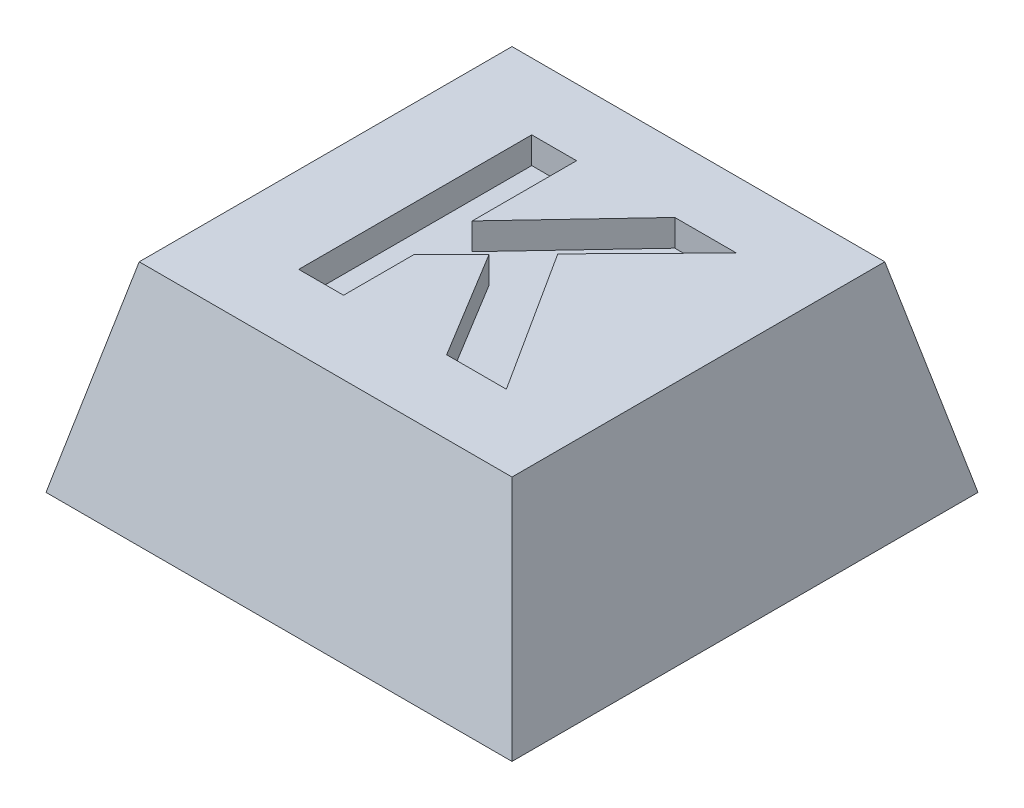
ISO-10303-21;
HEADER;
FILE_DESCRIPTION(('STEP AP214'),'2;1');
FILE_NAME('part.step','',(''),(''),'','','');
FILE_SCHEMA(('AUTOMOTIVE_DESIGN { 1 0 10303 214 1 1 1 1 }'));
ENDSEC;
DATA;
#1=APPLICATION_CONTEXT('core data for automotive mechanical design processes');
#2=APPLICATION_PROTOCOL_DEFINITION('international standard','automotive_design',2000,#1);
#3=PRODUCT_CONTEXT('',#1,'mechanical');
#4=PRODUCT('Part','Part','',(#3));
#5=PRODUCT_RELATED_PRODUCT_CATEGORY('part','',(#4));
#6=PRODUCT_DEFINITION_FORMATION('','',#4);
#7=PRODUCT_DEFINITION_CONTEXT('part definition',#1,'design');
#8=PRODUCT_DEFINITION('design','',#6,#7);
#9=PRODUCT_DEFINITION_SHAPE('','',#8);
#10=(LENGTH_UNIT() NAMED_UNIT(*) SI_UNIT(.MILLI.,.METRE.));
#11=(NAMED_UNIT(*) PLANE_ANGLE_UNIT() SI_UNIT($,.RADIAN.));
#12=(NAMED_UNIT(*) SI_UNIT($,.STERADIAN.) SOLID_ANGLE_UNIT());
#13=UNCERTAINTY_MEASURE_WITH_UNIT(LENGTH_MEASURE(1.E-05),#10,'distance_accuracy_value','');
#14=(GEOMETRIC_REPRESENTATION_CONTEXT(3) GLOBAL_UNCERTAINTY_ASSIGNED_CONTEXT((#13)) GLOBAL_UNIT_ASSIGNED_CONTEXT((#10,
#11,#12)) REPRESENTATION_CONTEXT('',''));
#15=CARTESIAN_POINT('',(0.,0.,0.));
#16=DIRECTION('',(0.,0.,1.));
#17=DIRECTION('',(1.,0.,0.));
#18=AXIS2_PLACEMENT_3D('',#15,#16,#17);
#19=CARTESIAN_POINT('',(0.,3.,0.));
#20=DIRECTION('',(0.,-1.,0.));
#21=DIRECTION('',(0.,0.,-1.));
#22=AXIS2_PLACEMENT_3D('',#19,#20,#21);
#23=PLANE('',#22);
#24=DIRECTION('',(-1.,0.,0.));
#25=VECTOR('',#24,1.);
#26=CARTESIAN_POINT('',(11.,3.,-0.7));
#27=LINE('',#26,#25);
#28=CARTESIAN_POINT('',(6.3,3.,-0.7));
#29=VERTEX_POINT('',#28);
#30=CARTESIAN_POINT('',(0.7,3.,-0.7));
#31=VERTEX_POINT('',#30);
#32=EDGE_CURVE('E65',#29,#31,#27,.T.);
#33=ORIENTED_EDGE('',*,*,#32,.F.);
#34=DIRECTION('',(0.,0.,1.));
#35=VECTOR('',#34,1.);
#36=CARTESIAN_POINT('',(6.3,3.,-7.));
#37=LINE('',#36,#35);
#38=CARTESIAN_POINT('',(6.3,3.,-6.3));
#39=VERTEX_POINT('',#38);
#40=EDGE_CURVE('E206',#39,#29,#37,.T.);
#41=ORIENTED_EDGE('',*,*,#40,.F.);
#42=DIRECTION('',(-1.,0.,0.));
#43=VECTOR('',#42,1.);
#44=CARTESIAN_POINT('',(11.,3.,-6.3));
#45=LINE('',#44,#43);
#46=CARTESIAN_POINT('',(0.699999999999998,3.,-6.3));
#47=VERTEX_POINT('',#46);
#48=EDGE_CURVE('E193',#39,#47,#45,.T.);
#49=ORIENTED_EDGE('',*,*,#48,.T.);
#50=DIRECTION('',(0.,0.,1.));
#51=VECTOR('',#50,1.);
#52=CARTESIAN_POINT('',(0.7,3.,-7.));
#53=LINE('',#52,#51);
#54=EDGE_CURVE('E207',#47,#31,#53,.T.);
#55=ORIENTED_EDGE('',*,*,#54,.T.);
#56=EDGE_LOOP('',(#33,#41,#49,#55));
#57=FACE_BOUND('',#56,.T.);
#58=DIRECTION('',(-1.,0.,0.));
#59=VECTOR('',#58,1.);
#60=CARTESIAN_POINT('',(2.66988821627738,3.,-1.79976415733689));
#61=LINE('',#60,#59);
#62=CARTESIAN_POINT('',(2.66988821627738,3.,-1.79976415733689));
#63=VERTEX_POINT('',#62);
#64=CARTESIAN_POINT('',(1.99681129320046,3.,-1.79976415733689));
#65=VERTEX_POINT('',#64);
#66=EDGE_CURVE('E58',#63,#65,#61,.T.);
#67=ORIENTED_EDGE('',*,*,#66,.T.);
#68=DIRECTION('',(0.,0.,-1.));
#69=VECTOR('',#68,1.);
#70=CARTESIAN_POINT('',(1.99681129320046,3.,-1.79976415733689));
#71=LINE('',#70,#69);
#72=CARTESIAN_POINT('',(1.99681129320046,3.,-5.29976415733689));
#73=VERTEX_POINT('',#72);
#74=EDGE_CURVE('E177',#65,#73,#71,.T.);
#75=ORIENTED_EDGE('',*,*,#74,.T.);
#76=DIRECTION('',(1.,0.,0.));
#77=VECTOR('',#76,1.);
#78=CARTESIAN_POINT('',(1.99681129320046,3.,-5.29976415733689));
#79=LINE('',#78,#77);
#80=CARTESIAN_POINT('',(2.66988821627738,3.,-5.29976415733689));
#81=VERTEX_POINT('',#80);
#82=EDGE_CURVE('E532',#73,#81,#79,.T.);
#83=ORIENTED_EDGE('',*,*,#82,.T.);
#84=DIRECTION('',(0.,0.,1.));
#85=VECTOR('',#84,1.);
#86=CARTESIAN_POINT('',(2.66988821627738,3.,-5.29976415733689));
#87=LINE('',#86,#85);
#88=CARTESIAN_POINT('',(2.66988821627738,3.,-3.73275694579843));
#89=VERTEX_POINT('',#88);
#90=EDGE_CURVE('E534',#81,#89,#87,.T.);
#91=ORIENTED_EDGE('',*,*,#90,.T.);
#92=DIRECTION('',(0.685618651018228,0.,-0.727960895499164));
#93=VECTOR('',#92,1.);
#94=CARTESIAN_POINT('',(2.66988821627738,3.,-3.73275694579843));
#95=LINE('',#94,#93);
#96=CARTESIAN_POINT('',(4.14574959448251,3.,-5.29976415733689));
#97=VERTEX_POINT('',#96);
#98=EDGE_CURVE('E539',#89,#97,#95,.T.);
#99=ORIENTED_EDGE('',*,*,#98,.T.);
#100=DIRECTION('',(1.,0.,0.));
#101=VECTOR('',#100,1.);
#102=CARTESIAN_POINT('',(4.14574959448251,3.,-5.29976415733689));
#103=LINE('',#102,#101);
#104=CARTESIAN_POINT('',(5.07052924191841,3.,-5.29976415733689));
#105=VERTEX_POINT('',#104);
#106=EDGE_CURVE('E549',#97,#105,#103,.T.);
#107=ORIENTED_EDGE('',*,*,#106,.T.);
#108=DIRECTION('',(-0.700795359660879,0.,0.713362365055642));
#109=VECTOR('',#108,1.);
#110=CARTESIAN_POINT('',(5.07052924191841,3.,-5.29976415733689));
#111=LINE('',#110,#109);
#112=CARTESIAN_POINT('',(3.74120231884149,3.,-3.94659909323432));
#113=VERTEX_POINT('',#112);
#114=EDGE_CURVE('E553',#105,#113,#111,.T.);
#115=ORIENTED_EDGE('',*,*,#114,.T.);
#116=DIRECTION('',(0.53911613745139,0.,0.842231435140896));
#117=VECTOR('',#116,1.);
#118=CARTESIAN_POINT('',(3.74120231884149,3.,-3.94659909323432));
#119=LINE('',#118,#117);
#120=CARTESIAN_POINT('',(5.11540103679021,3.,-1.79976415733689));
#121=VERTEX_POINT('',#120);
#122=EDGE_CURVE('E557',#113,#121,#119,.T.);
#123=ORIENTED_EDGE('',*,*,#122,.T.);
#124=DIRECTION('',(-1.,0.,0.));
#125=VECTOR('',#124,1.);
#126=CARTESIAN_POINT('',(5.11540103679021,3.,-1.79976415733689));
#127=LINE('',#126,#125);
#128=CARTESIAN_POINT('',(4.21866626114918,3.,-1.79976415733689));
#129=VERTEX_POINT('',#128);
#130=EDGE_CURVE('E498',#121,#129,#127,.T.);
#131=ORIENTED_EDGE('',*,*,#130,.T.);
#132=DIRECTION('',(-0.519256993232864,0.,-0.854618145711151));
#133=VECTOR('',#132,1.);
#134=CARTESIAN_POINT('',(4.21866626114918,3.,-1.79976415733689));
#135=LINE('',#134,#133);
#136=CARTESIAN_POINT('',(3.23078565217482,3.,-3.42566559964458));
#137=VERTEX_POINT('',#136);
#138=EDGE_CURVE('E493',#129,#137,#135,.T.);
#139=ORIENTED_EDGE('',*,*,#138,.T.);
#140=DIRECTION('',(-0.700946895976961,0.,0.713213466656557));
#141=VECTOR('',#140,1.);
#142=CARTESIAN_POINT('',(3.23078565217482,3.,-3.42566559964458));
#143=LINE('',#142,#141);
#144=CARTESIAN_POINT('',(2.66988821627738,3.,-2.85495245861894));
#145=VERTEX_POINT('',#144);
#146=EDGE_CURVE('E487',#137,#145,#143,.T.);
#147=ORIENTED_EDGE('',*,*,#146,.T.);
#148=DIRECTION('',(0.,0.,1.));
#149=VECTOR('',#148,1.);
#150=CARTESIAN_POINT('',(2.66988821627738,3.,-2.85495245861894));
#151=LINE('',#150,#149);
#152=EDGE_CURVE('E173',#145,#63,#151,.T.);
#153=ORIENTED_EDGE('',*,*,#152,.T.);
#154=EDGE_LOOP('',(#67,#75,#83,#91,#99,#107,#115,#123,#131,#139,#147,#153));
#155=FACE_BOUND('',#154,.T.);
#156=ADVANCED_FACE('F42',(#57,#155),#23,.F.);
#157=CARTESIAN_POINT('',(7.,0.,-7.));
#158=DIRECTION('',(-0.973841209741793,-0.227229615606418,0.));
#159=DIRECTION('',(0.227229615606418,-0.973841209741793,0.));
#160=AXIS2_PLACEMENT_3D('',#157,#158,#159);
#161=PLANE('',#160);
#162=DIRECTION('',(-0.221581128241521,0.949633406749377,-0.221581128241521));
#163=VECTOR('',#162,1.);
#164=CARTESIAN_POINT('',(6.6563126252505,1.47294589178357,-0.343687374749499));
#165=LINE('',#164,#163);
#166=CARTESIAN_POINT('',(7.,0.,0.));
#167=VERTEX_POINT('',#166);
#168=EDGE_CURVE('E203',#167,#29,#165,.T.);
#169=ORIENTED_EDGE('',*,*,#168,.F.);
#170=DIRECTION('',(0.,0.,-1.));
#171=VECTOR('',#170,1.);
#172=CARTESIAN_POINT('',(7.,0.,0.));
#173=LINE('',#172,#171);
#174=CARTESIAN_POINT('',(7.,0.,-7.));
#175=VERTEX_POINT('',#174);
#176=EDGE_CURVE('E221',#167,#175,#173,.T.);
#177=ORIENTED_EDGE('',*,*,#176,.T.);
#178=DIRECTION('',(0.221581128241521,-0.949633406749377,-0.221581128241521));
#179=VECTOR('',#178,1.);
#180=CARTESIAN_POINT('',(7.,0.,-7.));
#181=LINE('',#180,#179);
#182=EDGE_CURVE('E197',#39,#175,#181,.T.);
#183=ORIENTED_EDGE('',*,*,#182,.F.);
#184=ORIENTED_EDGE('',*,*,#40,.T.);
#185=EDGE_LOOP('',(#169,#177,#183,#184));
#186=FACE_BOUND('',#185,.T.);
#187=ADVANCED_FACE('F246',(#186),#161,.F.);
#188=CARTESIAN_POINT('',(0.,0.,-7.));
#189=DIRECTION('',(0.973841209741793,-0.227229615606418,0.));
#190=DIRECTION('',(0.227229615606418,0.973841209741793,0.));
#191=AXIS2_PLACEMENT_3D('',#188,#189,#190);
#192=PLANE('',#191);
#193=DIRECTION('',(-0.221581128241521,-0.949633406749378,0.221581128241521));
#194=VECTOR('',#193,1.);
#195=CARTESIAN_POINT('',(0.343687374749499,1.47294589178357,-0.3436873747495));
#196=LINE('',#195,#194);
#197=CARTESIAN_POINT('',(0.,0.,0.));
#198=VERTEX_POINT('',#197);
#199=EDGE_CURVE('E11',#31,#198,#196,.T.);
#200=ORIENTED_EDGE('',*,*,#199,.F.);
#201=ORIENTED_EDGE('',*,*,#54,.F.);
#202=DIRECTION('',(0.221581128241521,0.949633406749377,0.221581128241521));
#203=VECTOR('',#202,1.);
#204=CARTESIAN_POINT('',(0.,0.,-7.));
#205=LINE('',#204,#203);
#206=CARTESIAN_POINT('',(0.,0.,-7.));
#207=VERTEX_POINT('',#206);
#208=EDGE_CURVE('E51',#207,#47,#205,.T.);
#209=ORIENTED_EDGE('',*,*,#208,.F.);
#210=DIRECTION('',(0.,0.,1.));
#211=VECTOR('',#210,1.);
#212=CARTESIAN_POINT('',(0.,0.,0.));
#213=LINE('',#212,#211);
#214=EDGE_CURVE('E211',#207,#198,#213,.T.);
#215=ORIENTED_EDGE('',*,*,#214,.T.);
#216=EDGE_LOOP('',(#200,#201,#209,#215));
#217=FACE_BOUND('',#216,.T.);
#218=ADVANCED_FACE('F239',(#217),#192,.F.);
#219=CARTESIAN_POINT('',(0.,0.,0.));
#220=DIRECTION('',(0.,-1.,0.));
#221=DIRECTION('',(0.,0.,-1.));
#222=AXIS2_PLACEMENT_3D('',#219,#220,#221);
#223=PLANE('',#222);
#224=CARTESIAN_POINT('',(3.5,0.,-3.5));
#225=DIRECTION('',(0.,-1.,0.));
#226=DIRECTION('',(0.,0.,-1.));
#227=AXIS2_PLACEMENT_3D('',#224,#225,#226);
#228=CIRCLE('',#227,1.8);
#229=CARTESIAN_POINT('',(3.5,0.,-5.3));
#230=VERTEX_POINT('',#229);
#231=EDGE_CURVE('E179',#230,#230,#228,.T.);
#232=ORIENTED_EDGE('',*,*,#231,.F.);
#233=EDGE_LOOP('',(#232));
#234=FACE_BOUND('',#233,.T.);
#235=ORIENTED_EDGE('',*,*,#214,.F.);
#236=DIRECTION('',(-1.,0.,0.));
#237=VECTOR('',#236,1.);
#238=CARTESIAN_POINT('',(0.,0.,-7.));
#239=LINE('',#238,#237);
#240=EDGE_CURVE('E225',#175,#207,#239,.T.);
#241=ORIENTED_EDGE('',*,*,#240,.F.);
#242=ORIENTED_EDGE('',*,*,#176,.F.);
#243=DIRECTION('',(1.,0.,0.));
#244=VECTOR('',#243,1.);
#245=CARTESIAN_POINT('',(0.,0.,0.));
#246=LINE('',#245,#244);
#247=EDGE_CURVE('E218',#198,#167,#246,.T.);
#248=ORIENTED_EDGE('',*,*,#247,.F.);
#249=EDGE_LOOP('',(#235,#241,#242,#248));
#250=FACE_BOUND('',#249,.T.);
#251=ADVANCED_FACE('F44',(#234,#250),#223,.T.);
#252=CARTESIAN_POINT('',(11.,3.,-6.3));
#253=DIRECTION('',(0.,0.227229615606418,-0.973841209741793));
#254=DIRECTION('',(0.,0.973841209741793,0.227229615606418));
#255=AXIS2_PLACEMENT_3D('',#252,#253,#254);
#256=PLANE('',#255);
#257=ORIENTED_EDGE('',*,*,#182,.T.);
#258=ORIENTED_EDGE('',*,*,#240,.T.);
#259=ORIENTED_EDGE('',*,*,#208,.T.);
#260=ORIENTED_EDGE('',*,*,#48,.F.);
#261=EDGE_LOOP('',(#257,#258,#259,#260));
#262=FACE_BOUND('',#261,.T.);
#263=ADVANCED_FACE('F230',(#262),#256,.T.);
#264=CARTESIAN_POINT('',(11.,0.,0.));
#265=DIRECTION('',(0.,0.227229615606418,0.973841209741793));
#266=DIRECTION('',(0.,-0.973841209741793,0.227229615606418));
#267=AXIS2_PLACEMENT_3D('',#264,#265,#266);
#268=PLANE('',#267);
#269=ORIENTED_EDGE('',*,*,#168,.T.);
#270=ORIENTED_EDGE('',*,*,#32,.T.);
#271=ORIENTED_EDGE('',*,*,#199,.T.);
#272=ORIENTED_EDGE('',*,*,#247,.T.);
#273=EDGE_LOOP('',(#269,#270,#271,#272));
#274=FACE_BOUND('',#273,.T.);
#275=ADVANCED_FACE('F241',(#274),#268,.T.);
#276=CARTESIAN_POINT('',(3.5,0.8,-3.5));
#277=DIRECTION('',(0.,-1.,0.));
#278=DIRECTION('',(0.,0.,-1.));
#279=AXIS2_PLACEMENT_3D('',#276,#277,#278);
#280=CYLINDRICAL_SURFACE('',#279,1.8);
#281=CARTESIAN_POINT('',(3.5,0.8,-3.5));
#282=DIRECTION('',(0.,-1.,0.));
#283=DIRECTION('',(0.,0.,-1.));
#284=AXIS2_PLACEMENT_3D('',#281,#282,#283);
#285=CIRCLE('',#284,1.8);
#286=CARTESIAN_POINT('',(3.5,0.8,-5.3));
#287=VERTEX_POINT('',#286);
#288=EDGE_CURVE('E185',#287,#287,#285,.T.);
#289=ORIENTED_EDGE('',*,*,#288,.F.);
#290=EDGE_LOOP('',(#289));
#291=FACE_BOUND('',#290,.T.);
#292=ORIENTED_EDGE('',*,*,#231,.T.);
#293=EDGE_LOOP('',(#292));
#294=FACE_BOUND('',#293,.T.);
#295=ADVANCED_FACE('F266',(#291,#294),#280,.F.);
#296=CARTESIAN_POINT('',(3.5,0.8,-3.5));
#297=DIRECTION('',(0.,-1.,0.));
#298=DIRECTION('',(0.,0.,-1.));
#299=AXIS2_PLACEMENT_3D('',#296,#297,#298);
#300=PLANE('',#299);
#301=ORIENTED_EDGE('',*,*,#288,.T.);
#302=EDGE_LOOP('',(#301));
#303=FACE_BOUND('',#302,.T.);
#304=ADVANCED_FACE('F269',(#303),#300,.T.);
#305=CARTESIAN_POINT('',(2.66988821627738,2.6,-1.79976415733689));
#306=DIRECTION('',(0.,0.,-1.));
#307=DIRECTION('',(-1.,0.,0.));
#308=AXIS2_PLACEMENT_3D('',#305,#306,#307);
#309=PLANE('',#308);
#310=ORIENTED_EDGE('',*,*,#66,.F.);
#311=DIRECTION('',(0.,1.,0.));
#312=VECTOR('',#311,1.);
#313=CARTESIAN_POINT('',(2.66988821627738,2.6,-1.79976415733689));
#314=LINE('',#313,#312);
#315=CARTESIAN_POINT('',(2.66988821627738,2.6,-1.79976415733689));
#316=VERTEX_POINT('',#315);
#317=EDGE_CURVE('E171',#316,#63,#314,.T.);
#318=ORIENTED_EDGE('',*,*,#317,.F.);
#319=DIRECTION('',(-1.,0.,0.));
#320=VECTOR('',#319,1.);
#321=CARTESIAN_POINT('',(2.66988821627738,2.6,-1.79976415733689));
#322=LINE('',#321,#320);
#323=CARTESIAN_POINT('',(1.99681129320046,2.6,-1.79976415733689));
#324=VERTEX_POINT('',#323);
#325=EDGE_CURVE('E161',#316,#324,#322,.T.);
#326=ORIENTED_EDGE('',*,*,#325,.T.);
#327=DIRECTION('',(0.,1.,0.));
#328=VECTOR('',#327,1.);
#329=CARTESIAN_POINT('',(1.99681129320046,2.6,-1.79976415733689));
#330=LINE('',#329,#328);
#331=EDGE_CURVE('E170',#324,#65,#330,.T.);
#332=ORIENTED_EDGE('',*,*,#331,.T.);
#333=EDGE_LOOP('',(#310,#318,#326,#332));
#334=FACE_BOUND('',#333,.T.);
#335=ADVANCED_FACE('F169',(#334),#309,.T.);
#336=CARTESIAN_POINT('',(1.99681129320046,2.6,-1.79976415733689));
#337=DIRECTION('',(1.,0.,0.));
#338=DIRECTION('',(0.,0.,-1.));
#339=AXIS2_PLACEMENT_3D('',#336,#337,#338);
#340=PLANE('',#339);
#341=ORIENTED_EDGE('',*,*,#74,.F.);
#342=ORIENTED_EDGE('',*,*,#331,.F.);
#343=DIRECTION('',(0.,0.,-1.));
#344=VECTOR('',#343,1.);
#345=CARTESIAN_POINT('',(1.99681129320046,2.6,-1.79976415733689));
#346=LINE('',#345,#344);
#347=CARTESIAN_POINT('',(1.99681129320046,2.6,-5.29976415733689));
#348=VERTEX_POINT('',#347);
#349=EDGE_CURVE('E157',#324,#348,#346,.T.);
#350=ORIENTED_EDGE('',*,*,#349,.T.);
#351=DIRECTION('',(0.,1.,0.));
#352=VECTOR('',#351,1.);
#353=CARTESIAN_POINT('',(1.99681129320046,2.6,-5.29976415733689));
#354=LINE('',#353,#352);
#355=EDGE_CURVE('E180',#348,#73,#354,.T.);
#356=ORIENTED_EDGE('',*,*,#355,.T.);
#357=EDGE_LOOP('',(#341,#342,#350,#356));
#358=FACE_BOUND('',#357,.T.);
#359=ADVANCED_FACE('F175',(#358),#340,.T.);
#360=CARTESIAN_POINT('',(1.99681129320046,2.6,-5.29976415733689));
#361=DIRECTION('',(0.,0.,1.));
#362=DIRECTION('',(1.,0.,0.));
#363=AXIS2_PLACEMENT_3D('',#360,#361,#362);
#364=PLANE('',#363);
#365=ORIENTED_EDGE('',*,*,#82,.F.);
#366=ORIENTED_EDGE('',*,*,#355,.F.);
#367=DIRECTION('',(1.,0.,0.));
#368=VECTOR('',#367,1.);
#369=CARTESIAN_POINT('',(1.99681129320046,2.6,-5.29976415733689));
#370=LINE('',#369,#368);
#371=CARTESIAN_POINT('',(2.66988821627738,2.6,-5.29976415733689));
#372=VERTEX_POINT('',#371);
#373=EDGE_CURVE('E163',#348,#372,#370,.T.);
#374=ORIENTED_EDGE('',*,*,#373,.T.);
#375=DIRECTION('',(0.,1.,0.));
#376=VECTOR('',#375,1.);
#377=CARTESIAN_POINT('',(2.66988821627738,2.6,-5.29976415733689));
#378=LINE('',#377,#376);
#379=EDGE_CURVE('E187',#372,#81,#378,.T.);
#380=ORIENTED_EDGE('',*,*,#379,.T.);
#381=EDGE_LOOP('',(#365,#366,#374,#380));
#382=FACE_BOUND('',#381,.T.);
#383=ADVANCED_FACE('F278',(#382),#364,.T.);
#384=CARTESIAN_POINT('',(2.66988821627738,2.6,-5.29976415733689));
#385=DIRECTION('',(-1.,0.,0.));
#386=DIRECTION('',(0.,0.,1.));
#387=AXIS2_PLACEMENT_3D('',#384,#385,#386);
#388=PLANE('',#387);
#389=ORIENTED_EDGE('',*,*,#90,.F.);
#390=ORIENTED_EDGE('',*,*,#379,.F.);
#391=DIRECTION('',(0.,0.,1.));
#392=VECTOR('',#391,1.);
#393=CARTESIAN_POINT('',(2.66988821627738,2.6,-5.29976415733689));
#394=LINE('',#393,#392);
#395=CARTESIAN_POINT('',(2.66988821627738,2.6,-3.73275694579843));
#396=VERTEX_POINT('',#395);
#397=EDGE_CURVE('E593',#372,#396,#394,.T.);
#398=ORIENTED_EDGE('',*,*,#397,.T.);
#399=DIRECTION('',(0.,1.,0.));
#400=VECTOR('',#399,1.);
#401=CARTESIAN_POINT('',(2.66988821627738,2.6,-3.73275694579843));
#402=LINE('',#401,#400);
#403=EDGE_CURVE('E525',#396,#89,#402,.T.);
#404=ORIENTED_EDGE('',*,*,#403,.T.);
#405=EDGE_LOOP('',(#389,#390,#398,#404));
#406=FACE_BOUND('',#405,.T.);
#407=ADVANCED_FACE('F281',(#406),#388,.T.);
#408=CARTESIAN_POINT('',(2.66988821627738,2.6,-3.73275694579843));
#409=DIRECTION('',(0.727960895499164,0.,0.685618651018228));
#410=DIRECTION('',(0.685618651018228,0.,-0.727960895499164));
#411=AXIS2_PLACEMENT_3D('',#408,#409,#410);
#412=PLANE('',#411);
#413=ORIENTED_EDGE('',*,*,#98,.F.);
#414=ORIENTED_EDGE('',*,*,#403,.F.);
#415=DIRECTION('',(0.685618651018228,0.,-0.727960895499164));
#416=VECTOR('',#415,1.);
#417=CARTESIAN_POINT('',(2.66988821627738,2.6,-3.73275694579843));
#418=LINE('',#417,#416);
#419=CARTESIAN_POINT('',(4.14574959448251,2.6,-5.29976415733689));
#420=VERTEX_POINT('',#419);
#421=EDGE_CURVE('E590',#396,#420,#418,.T.);
#422=ORIENTED_EDGE('',*,*,#421,.T.);
#423=DIRECTION('',(0.,1.,0.));
#424=VECTOR('',#423,1.);
#425=CARTESIAN_POINT('',(4.14574959448251,2.6,-5.29976415733689));
#426=LINE('',#425,#424);
#427=EDGE_CURVE('E522',#420,#97,#426,.T.);
#428=ORIENTED_EDGE('',*,*,#427,.T.);
#429=EDGE_LOOP('',(#413,#414,#422,#428));
#430=FACE_BOUND('',#429,.T.);
#431=ADVANCED_FACE('F285',(#430),#412,.T.);
#432=CARTESIAN_POINT('',(4.14574959448251,2.6,-5.29976415733689));
#433=DIRECTION('',(0.,0.,1.));
#434=DIRECTION('',(1.,0.,0.));
#435=AXIS2_PLACEMENT_3D('',#432,#433,#434);
#436=PLANE('',#435);
#437=ORIENTED_EDGE('',*,*,#106,.F.);
#438=ORIENTED_EDGE('',*,*,#427,.F.);
#439=DIRECTION('',(1.,0.,0.));
#440=VECTOR('',#439,1.);
#441=CARTESIAN_POINT('',(4.14574959448251,2.6,-5.29976415733689));
#442=LINE('',#441,#440);
#443=CARTESIAN_POINT('',(5.07052924191841,2.6,-5.29976415733689));
#444=VERTEX_POINT('',#443);
#445=EDGE_CURVE('E587',#420,#444,#442,.T.);
#446=ORIENTED_EDGE('',*,*,#445,.T.);
#447=DIRECTION('',(0.,1.,0.));
#448=VECTOR('',#447,1.);
#449=CARTESIAN_POINT('',(5.07052924191841,2.6,-5.29976415733689));
#450=LINE('',#449,#448);
#451=EDGE_CURVE('E519',#444,#105,#450,.T.);
#452=ORIENTED_EDGE('',*,*,#451,.T.);
#453=EDGE_LOOP('',(#437,#438,#446,#452));
#454=FACE_BOUND('',#453,.T.);
#455=ADVANCED_FACE('F289',(#454),#436,.T.);
#456=CARTESIAN_POINT('',(5.07052924191841,2.6,-5.29976415733689));
#457=DIRECTION('',(-0.713362365055642,0.,-0.700795359660879));
#458=DIRECTION('',(-0.700795359660879,0.,0.713362365055642));
#459=AXIS2_PLACEMENT_3D('',#456,#457,#458);
#460=PLANE('',#459);
#461=ORIENTED_EDGE('',*,*,#114,.F.);
#462=ORIENTED_EDGE('',*,*,#451,.F.);
#463=DIRECTION('',(-0.700795359660879,0.,0.713362365055642));
#464=VECTOR('',#463,1.);
#465=CARTESIAN_POINT('',(5.07052924191841,2.6,-5.29976415733689));
#466=LINE('',#465,#464);
#467=CARTESIAN_POINT('',(3.74120231884149,2.6,-3.94659909323432));
#468=VERTEX_POINT('',#467);
#469=EDGE_CURVE('E584',#444,#468,#466,.T.);
#470=ORIENTED_EDGE('',*,*,#469,.T.);
#471=DIRECTION('',(0.,1.,0.));
#472=VECTOR('',#471,1.);
#473=CARTESIAN_POINT('',(3.74120231884149,2.6,-3.94659909323432));
#474=LINE('',#473,#472);
#475=EDGE_CURVE('E516',#468,#113,#474,.T.);
#476=ORIENTED_EDGE('',*,*,#475,.T.);
#477=EDGE_LOOP('',(#461,#462,#470,#476));
#478=FACE_BOUND('',#477,.T.);
#479=ADVANCED_FACE('F293',(#478),#460,.T.);
#480=CARTESIAN_POINT('',(3.74120231884149,2.6,-3.94659909323432));
#481=DIRECTION('',(-0.842231435140896,0.,0.53911613745139));
#482=DIRECTION('',(0.53911613745139,0.,0.842231435140896));
#483=AXIS2_PLACEMENT_3D('',#480,#481,#482);
#484=PLANE('',#483);
#485=ORIENTED_EDGE('',*,*,#122,.F.);
#486=ORIENTED_EDGE('',*,*,#475,.F.);
#487=DIRECTION('',(0.53911613745139,0.,0.842231435140896));
#488=VECTOR('',#487,1.);
#489=CARTESIAN_POINT('',(3.74120231884149,2.6,-3.94659909323432));
#490=LINE('',#489,#488);
#491=CARTESIAN_POINT('',(5.11540103679021,2.6,-1.79976415733689));
#492=VERTEX_POINT('',#491);
#493=EDGE_CURVE('E581',#468,#492,#490,.T.);
#494=ORIENTED_EDGE('',*,*,#493,.T.);
#495=DIRECTION('',(0.,1.,0.));
#496=VECTOR('',#495,1.);
#497=CARTESIAN_POINT('',(5.11540103679021,2.6,-1.79976415733689));
#498=LINE('',#497,#496);
#499=EDGE_CURVE('E513',#492,#121,#498,.T.);
#500=ORIENTED_EDGE('',*,*,#499,.T.);
#501=EDGE_LOOP('',(#485,#486,#494,#500));
#502=FACE_BOUND('',#501,.T.);
#503=ADVANCED_FACE('F297',(#502),#484,.T.);
#504=CARTESIAN_POINT('',(5.11540103679021,2.6,-1.79976415733689));
#505=DIRECTION('',(0.,0.,-1.));
#506=DIRECTION('',(-1.,0.,0.));
#507=AXIS2_PLACEMENT_3D('',#504,#505,#506);
#508=PLANE('',#507);
#509=ORIENTED_EDGE('',*,*,#130,.F.);
#510=ORIENTED_EDGE('',*,*,#499,.F.);
#511=DIRECTION('',(-1.,0.,0.));
#512=VECTOR('',#511,1.);
#513=CARTESIAN_POINT('',(5.11540103679021,2.6,-1.79976415733689));
#514=LINE('',#513,#512);
#515=CARTESIAN_POINT('',(4.21866626114918,2.6,-1.79976415733689));
#516=VERTEX_POINT('',#515);
#517=EDGE_CURVE('E566',#492,#516,#514,.T.);
#518=ORIENTED_EDGE('',*,*,#517,.T.);
#519=DIRECTION('',(0.,1.,0.));
#520=VECTOR('',#519,1.);
#521=CARTESIAN_POINT('',(4.21866626114918,2.6,-1.79976415733689));
#522=LINE('',#521,#520);
#523=EDGE_CURVE('E510',#516,#129,#522,.T.);
#524=ORIENTED_EDGE('',*,*,#523,.T.);
#525=EDGE_LOOP('',(#509,#510,#518,#524));
#526=FACE_BOUND('',#525,.T.);
#527=ADVANCED_FACE('F301',(#526),#508,.T.);
#528=CARTESIAN_POINT('',(4.21866626114918,2.6,-1.79976415733689));
#529=DIRECTION('',(0.854618145711151,0.,-0.519256993232864));
#530=DIRECTION('',(-0.519256993232864,0.,-0.854618145711151));
#531=AXIS2_PLACEMENT_3D('',#528,#529,#530);
#532=PLANE('',#531);
#533=ORIENTED_EDGE('',*,*,#138,.F.);
#534=ORIENTED_EDGE('',*,*,#523,.F.);
#535=DIRECTION('',(-0.519256993232864,0.,-0.854618145711151));
#536=VECTOR('',#535,1.);
#537=CARTESIAN_POINT('',(4.21866626114918,2.6,-1.79976415733689));
#538=LINE('',#537,#536);
#539=CARTESIAN_POINT('',(3.23078565217482,2.6,-3.42566559964458));
#540=VERTEX_POINT('',#539);
#541=EDGE_CURVE('E568',#516,#540,#538,.T.);
#542=ORIENTED_EDGE('',*,*,#541,.T.);
#543=DIRECTION('',(0.,1.,0.));
#544=VECTOR('',#543,1.);
#545=CARTESIAN_POINT('',(3.23078565217482,2.6,-3.42566559964458));
#546=LINE('',#545,#544);
#547=EDGE_CURVE('E507',#540,#137,#546,.T.);
#548=ORIENTED_EDGE('',*,*,#547,.T.);
#549=EDGE_LOOP('',(#533,#534,#542,#548));
#550=FACE_BOUND('',#549,.T.);
#551=ADVANCED_FACE('F305',(#550),#532,.T.);
#552=CARTESIAN_POINT('',(3.23078565217482,2.6,-3.42566559964458));
#553=DIRECTION('',(-0.713213466656557,0.,-0.700946895976961));
#554=DIRECTION('',(-0.700946895976961,0.,0.713213466656557));
#555=AXIS2_PLACEMENT_3D('',#552,#553,#554);
#556=PLANE('',#555);
#557=ORIENTED_EDGE('',*,*,#146,.F.);
#558=ORIENTED_EDGE('',*,*,#547,.F.);
#559=DIRECTION('',(-0.700946895976961,0.,0.713213466656557));
#560=VECTOR('',#559,1.);
#561=CARTESIAN_POINT('',(3.23078565217482,2.6,-3.42566559964458));
#562=LINE('',#561,#560);
#563=CARTESIAN_POINT('',(2.66988821627738,2.6,-2.85495245861894));
#564=VERTEX_POINT('',#563);
#565=EDGE_CURVE('E570',#540,#564,#562,.T.);
#566=ORIENTED_EDGE('',*,*,#565,.T.);
#567=DIRECTION('',(0.,1.,0.));
#568=VECTOR('',#567,1.);
#569=CARTESIAN_POINT('',(2.66988821627738,2.6,-2.85495245861894));
#570=LINE('',#569,#568);
#571=EDGE_CURVE('E485',#564,#145,#570,.T.);
#572=ORIENTED_EDGE('',*,*,#571,.T.);
#573=EDGE_LOOP('',(#557,#558,#566,#572));
#574=FACE_BOUND('',#573,.T.);
#575=ADVANCED_FACE('F309',(#574),#556,.T.);
#576=CARTESIAN_POINT('',(2.66988821627738,2.6,-2.85495245861894));
#577=DIRECTION('',(-1.,0.,0.));
#578=DIRECTION('',(0.,0.,1.));
#579=AXIS2_PLACEMENT_3D('',#576,#577,#578);
#580=PLANE('',#579);
#581=ORIENTED_EDGE('',*,*,#152,.F.);
#582=ORIENTED_EDGE('',*,*,#571,.F.);
#583=DIRECTION('',(0.,0.,1.));
#584=VECTOR('',#583,1.);
#585=CARTESIAN_POINT('',(2.66988821627738,2.6,-2.85495245861894));
#586=LINE('',#585,#584);
#587=EDGE_CURVE('E504',#564,#316,#586,.T.);
#588=ORIENTED_EDGE('',*,*,#587,.T.);
#589=ORIENTED_EDGE('',*,*,#317,.T.);
#590=EDGE_LOOP('',(#581,#582,#588,#589));
#591=FACE_BOUND('',#590,.T.);
#592=ADVANCED_FACE('F313',(#591),#580,.T.);
#593=CARTESIAN_POINT('',(0.,2.6,0.));
#594=DIRECTION('',(0.,-1.,0.));
#595=DIRECTION('',(0.,0.,-1.));
#596=AXIS2_PLACEMENT_3D('',#593,#594,#595);
#597=PLANE('',#596);
#598=ORIENTED_EDGE('',*,*,#325,.F.);
#599=ORIENTED_EDGE('',*,*,#587,.F.);
#600=ORIENTED_EDGE('',*,*,#565,.F.);
#601=ORIENTED_EDGE('',*,*,#541,.F.);
#602=ORIENTED_EDGE('',*,*,#517,.F.);
#603=ORIENTED_EDGE('',*,*,#493,.F.);
#604=ORIENTED_EDGE('',*,*,#469,.F.);
#605=ORIENTED_EDGE('',*,*,#445,.F.);
#606=ORIENTED_EDGE('',*,*,#421,.F.);
#607=ORIENTED_EDGE('',*,*,#397,.F.);
#608=ORIENTED_EDGE('',*,*,#373,.F.);
#609=ORIENTED_EDGE('',*,*,#349,.F.);
#610=EDGE_LOOP('',(#598,#599,#600,#601,#602,#603,#604,#605,#606,#607,#608,#609));
#611=FACE_BOUND('',#610,.T.);
#612=ADVANCED_FACE('F159',(#611),#597,.F.);
#613=CLOSED_SHELL('',(#156,#187,#218,#251,#263,#275,#295,#304,#335,#359,#383,#407,#431,#455,
#479,#503,#527,#551,#575,#592,#612));
#614=MANIFOLD_SOLID_BREP('B2',#613);
#615=ADVANCED_BREP_SHAPE_REPRESENTATION('',(#18,#614),#14);
#616=SHAPE_DEFINITION_REPRESENTATION(#9,#615);
ENDSEC;
END-ISO-10303-21;
